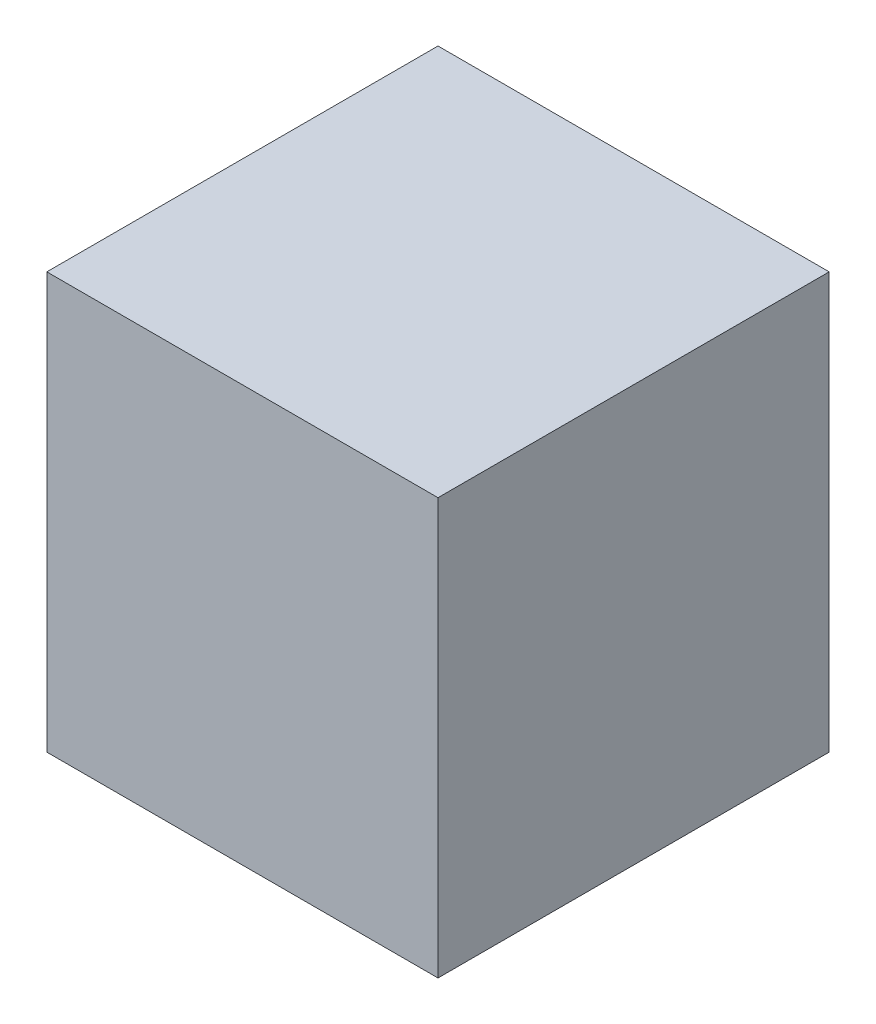
ISO-10303-21;
HEADER;
FILE_DESCRIPTION(('STEP AP214'),'2;1');
FILE_NAME('part.step','',(''),(''),'','','');
FILE_SCHEMA(('AUTOMOTIVE_DESIGN { 1 0 10303 214 1 1 1 1 }'));
ENDSEC;
DATA;
#1=APPLICATION_CONTEXT('core data for automotive mechanical design processes');
#2=APPLICATION_PROTOCOL_DEFINITION('international standard','automotive_design',2000,#1);
#3=PRODUCT_CONTEXT('',#1,'mechanical');
#4=PRODUCT('Part','Part','',(#3));
#5=PRODUCT_RELATED_PRODUCT_CATEGORY('part','',(#4));
#6=PRODUCT_DEFINITION_FORMATION('','',#4);
#7=PRODUCT_DEFINITION_CONTEXT('part definition',#1,'design');
#8=PRODUCT_DEFINITION('design','',#6,#7);
#9=PRODUCT_DEFINITION_SHAPE('','',#8);
#10=(LENGTH_UNIT() NAMED_UNIT(*) SI_UNIT(.MILLI.,.METRE.));
#11=(NAMED_UNIT(*) PLANE_ANGLE_UNIT() SI_UNIT($,.RADIAN.));
#12=(NAMED_UNIT(*) SI_UNIT($,.STERADIAN.) SOLID_ANGLE_UNIT());
#13=UNCERTAINTY_MEASURE_WITH_UNIT(LENGTH_MEASURE(1.E-05),#10,'distance_accuracy_value','');
#14=(GEOMETRIC_REPRESENTATION_CONTEXT(3) GLOBAL_UNCERTAINTY_ASSIGNED_CONTEXT((#13)) GLOBAL_UNIT_ASSIGNED_CONTEXT((#10,
#11,#12)) REPRESENTATION_CONTEXT('',''));
#15=CARTESIAN_POINT('',(0.,0.,0.));
#16=DIRECTION('',(0.,0.,1.));
#17=DIRECTION('',(1.,0.,0.));
#18=AXIS2_PLACEMENT_3D('',#15,#16,#17);
#19=CARTESIAN_POINT('',(28.4,-30.2,56.8));
#20=DIRECTION('',(-1.,0.,0.));
#21=DIRECTION('',(0.,0.,1.));
#22=AXIS2_PLACEMENT_3D('',#19,#20,#21);
#23=PLANE('',#22);
#24=DIRECTION('',(0.,1.,0.));
#25=VECTOR('',#24,1.);
#26=CARTESIAN_POINT('',(28.4,-30.2,0.));
#27=LINE('',#26,#25);
#28=CARTESIAN_POINT('',(28.4,-30.2,0.));
#29=VERTEX_POINT('',#28);
#30=CARTESIAN_POINT('',(28.4,30.2,0.));
#31=VERTEX_POINT('',#30);
#32=EDGE_CURVE('E102',#29,#31,#27,.T.);
#33=ORIENTED_EDGE('',*,*,#32,.T.);
#34=DIRECTION('',(0.,0.,-1.));
#35=VECTOR('',#34,1.);
#36=CARTESIAN_POINT('',(28.4,30.2,56.8));
#37=LINE('',#36,#35);
#38=CARTESIAN_POINT('',(28.4,30.2,56.8));
#39=VERTEX_POINT('',#38);
#40=EDGE_CURVE('E11',#39,#31,#37,.T.);
#41=ORIENTED_EDGE('',*,*,#40,.F.);
#42=DIRECTION('',(0.,1.,0.));
#43=VECTOR('',#42,1.);
#44=CARTESIAN_POINT('',(28.4,-30.2,56.8));
#45=LINE('',#44,#43);
#46=CARTESIAN_POINT('',(28.4,-30.2,56.8));
#47=VERTEX_POINT('',#46);
#48=EDGE_CURVE('E90',#47,#39,#45,.T.);
#49=ORIENTED_EDGE('',*,*,#48,.F.);
#50=DIRECTION('',(0.,0.,-1.));
#51=VECTOR('',#50,1.);
#52=CARTESIAN_POINT('',(28.4,-30.2,56.8));
#53=LINE('',#52,#51);
#54=EDGE_CURVE('E98',#47,#29,#53,.T.);
#55=ORIENTED_EDGE('',*,*,#54,.T.);
#56=EDGE_LOOP('',(#33,#41,#49,#55));
#57=FACE_BOUND('',#56,.T.);
#58=ADVANCED_FACE('F39',(#57),#23,.F.);
#59=CARTESIAN_POINT('',(-28.4,30.2,56.8));
#60=DIRECTION('',(0.,-1.,0.));
#61=DIRECTION('',(0.,0.,-1.));
#62=AXIS2_PLACEMENT_3D('',#59,#60,#61);
#63=PLANE('',#62);
#64=DIRECTION('',(-1.,0.,0.));
#65=VECTOR('',#64,1.);
#66=CARTESIAN_POINT('',(-28.4,30.2,0.));
#67=LINE('',#66,#65);
#68=CARTESIAN_POINT('',(-28.4,30.2,0.));
#69=VERTEX_POINT('',#68);
#70=EDGE_CURVE('E94',#31,#69,#67,.T.);
#71=ORIENTED_EDGE('',*,*,#70,.T.);
#72=DIRECTION('',(0.,0.,-1.));
#73=VECTOR('',#72,1.);
#74=CARTESIAN_POINT('',(-28.4,30.2,56.8));
#75=LINE('',#74,#73);
#76=CARTESIAN_POINT('',(-28.4,30.2,56.8));
#77=VERTEX_POINT('',#76);
#78=EDGE_CURVE('E47',#77,#69,#75,.T.);
#79=ORIENTED_EDGE('',*,*,#78,.F.);
#80=DIRECTION('',(-1.,0.,0.));
#81=VECTOR('',#80,1.);
#82=CARTESIAN_POINT('',(-28.4,30.2,56.8));
#83=LINE('',#82,#81);
#84=EDGE_CURVE('E85',#39,#77,#83,.T.);
#85=ORIENTED_EDGE('',*,*,#84,.F.);
#86=ORIENTED_EDGE('',*,*,#40,.T.);
#87=EDGE_LOOP('',(#71,#79,#85,#86));
#88=FACE_BOUND('',#87,.T.);
#89=ADVANCED_FACE('F93',(#88),#63,.F.);
#90=CARTESIAN_POINT('',(-28.4,-30.2,56.8));
#91=DIRECTION('',(1.,0.,0.));
#92=DIRECTION('',(0.,0.,-1.));
#93=AXIS2_PLACEMENT_3D('',#90,#91,#92);
#94=PLANE('',#93);
#95=DIRECTION('',(0.,-1.,0.));
#96=VECTOR('',#95,1.);
#97=CARTESIAN_POINT('',(-28.4,-30.2,0.));
#98=LINE('',#97,#96);
#99=CARTESIAN_POINT('',(-28.4,-30.2,0.));
#100=VERTEX_POINT('',#99);
#101=EDGE_CURVE('E72',#69,#100,#98,.T.);
#102=ORIENTED_EDGE('',*,*,#101,.T.);
#103=DIRECTION('',(0.,0.,-1.));
#104=VECTOR('',#103,1.);
#105=CARTESIAN_POINT('',(-28.4,-30.2,56.8));
#106=LINE('',#105,#104);
#107=CARTESIAN_POINT('',(-28.4,-30.2,56.8));
#108=VERTEX_POINT('',#107);
#109=EDGE_CURVE('E95',#108,#100,#106,.T.);
#110=ORIENTED_EDGE('',*,*,#109,.F.);
#111=DIRECTION('',(0.,-1.,0.));
#112=VECTOR('',#111,1.);
#113=CARTESIAN_POINT('',(-28.4,-30.2,56.8));
#114=LINE('',#113,#112);
#115=EDGE_CURVE('E88',#77,#108,#114,.T.);
#116=ORIENTED_EDGE('',*,*,#115,.F.);
#117=ORIENTED_EDGE('',*,*,#78,.T.);
#118=EDGE_LOOP('',(#102,#110,#116,#117));
#119=FACE_BOUND('',#118,.T.);
#120=ADVANCED_FACE('F96',(#119),#94,.F.);
#121=CARTESIAN_POINT('',(-28.4,-30.2,56.8));
#122=DIRECTION('',(0.,1.,0.));
#123=DIRECTION('',(0.,0.,1.));
#124=AXIS2_PLACEMENT_3D('',#121,#122,#123);
#125=PLANE('',#124);
#126=DIRECTION('',(1.,0.,0.));
#127=VECTOR('',#126,1.);
#128=CARTESIAN_POINT('',(-28.4,-30.2,0.));
#129=LINE('',#128,#127);
#130=EDGE_CURVE('E78',#100,#29,#129,.T.);
#131=ORIENTED_EDGE('',*,*,#130,.T.);
#132=ORIENTED_EDGE('',*,*,#54,.F.);
#133=DIRECTION('',(1.,0.,0.));
#134=VECTOR('',#133,1.);
#135=CARTESIAN_POINT('',(-28.4,-30.2,56.8));
#136=LINE('',#135,#134);
#137=EDGE_CURVE('E55',#108,#47,#136,.T.);
#138=ORIENTED_EDGE('',*,*,#137,.F.);
#139=ORIENTED_EDGE('',*,*,#109,.T.);
#140=EDGE_LOOP('',(#131,#132,#138,#139));
#141=FACE_BOUND('',#140,.T.);
#142=ADVANCED_FACE('F109',(#141),#125,.F.);
#143=CARTESIAN_POINT('',(0.,0.,56.8));
#144=DIRECTION('',(0.,0.,-1.));
#145=DIRECTION('',(-1.,0.,0.));
#146=AXIS2_PLACEMENT_3D('',#143,#144,#145);
#147=PLANE('',#146);
#148=ORIENTED_EDGE('',*,*,#48,.T.);
#149=ORIENTED_EDGE('',*,*,#84,.T.);
#150=ORIENTED_EDGE('',*,*,#115,.T.);
#151=ORIENTED_EDGE('',*,*,#137,.T.);
#152=EDGE_LOOP('',(#148,#149,#150,#151));
#153=FACE_BOUND('',#152,.T.);
#154=ADVANCED_FACE('F86',(#153),#147,.F.);
#155=CARTESIAN_POINT('',(0.,0.,0.));
#156=DIRECTION('',(0.,0.,-1.));
#157=DIRECTION('',(-1.,0.,0.));
#158=AXIS2_PLACEMENT_3D('',#155,#156,#157);
#159=PLANE('',#158);
#160=ORIENTED_EDGE('',*,*,#32,.F.);
#161=ORIENTED_EDGE('',*,*,#130,.F.);
#162=ORIENTED_EDGE('',*,*,#101,.F.);
#163=ORIENTED_EDGE('',*,*,#70,.F.);
#164=EDGE_LOOP('',(#160,#161,#162,#163));
#165=FACE_BOUND('',#164,.T.);
#166=ADVANCED_FACE('F112',(#165),#159,.T.);
#167=CLOSED_SHELL('',(#58,#89,#120,#142,#154,#166));
#168=MANIFOLD_SOLID_BREP('B2',#167);
#169=ADVANCED_BREP_SHAPE_REPRESENTATION('',(#18,#168),#14);
#170=SHAPE_DEFINITION_REPRESENTATION(#9,#169);
ENDSEC;
END-ISO-10303-21;
